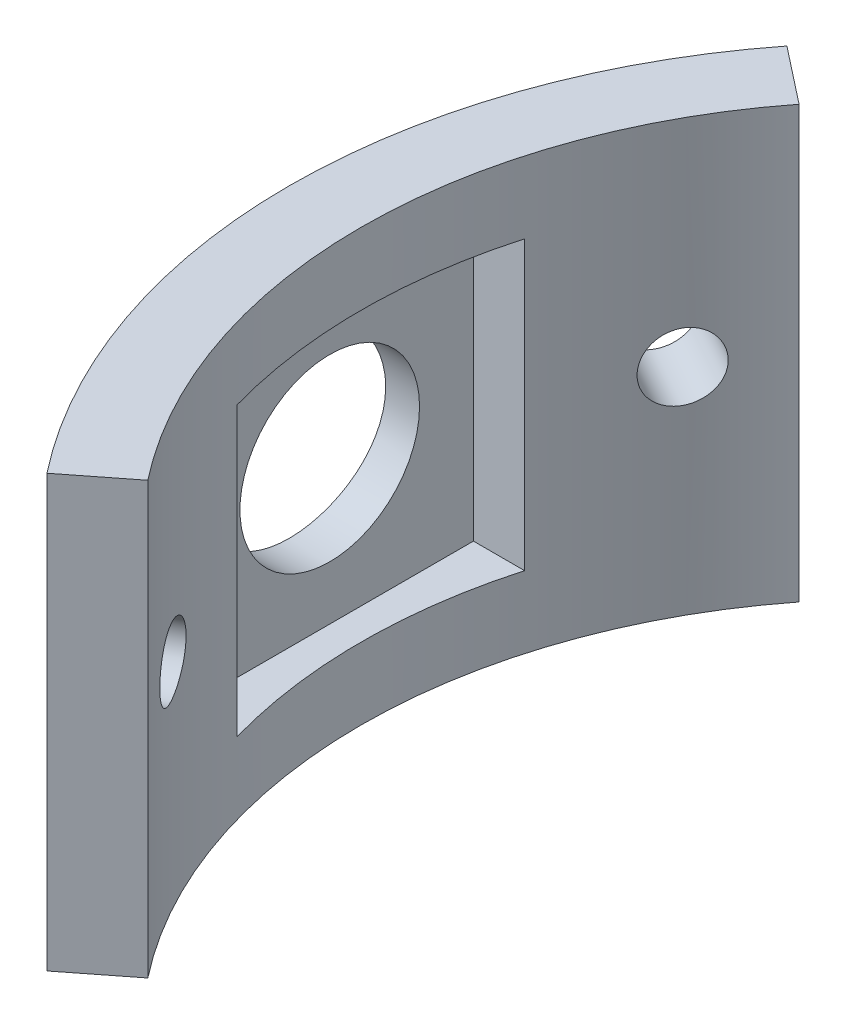
ISO-10303-21;
HEADER;
FILE_DESCRIPTION(('STEP AP214'),'2;1');
FILE_NAME('part.step','',(''),(''),'','','');
FILE_SCHEMA(('AUTOMOTIVE_DESIGN { 1 0 10303 214 1 1 1 1 }'));
ENDSEC;
DATA;
#1=APPLICATION_CONTEXT('core data for automotive mechanical design processes');
#2=APPLICATION_PROTOCOL_DEFINITION('international standard','automotive_design',2000,#1);
#3=PRODUCT_CONTEXT('',#1,'mechanical');
#4=PRODUCT('Part','Part','',(#3));
#5=PRODUCT_RELATED_PRODUCT_CATEGORY('part','',(#4));
#6=PRODUCT_DEFINITION_FORMATION('','',#4);
#7=PRODUCT_DEFINITION_CONTEXT('part definition',#1,'design');
#8=PRODUCT_DEFINITION('design','',#6,#7);
#9=PRODUCT_DEFINITION_SHAPE('','',#8);
#10=(LENGTH_UNIT() NAMED_UNIT(*) SI_UNIT(.MILLI.,.METRE.));
#11=(NAMED_UNIT(*) PLANE_ANGLE_UNIT() SI_UNIT($,.RADIAN.));
#12=(NAMED_UNIT(*) SI_UNIT($,.STERADIAN.) SOLID_ANGLE_UNIT());
#13=UNCERTAINTY_MEASURE_WITH_UNIT(LENGTH_MEASURE(1.E-05),#10,'distance_accuracy_value','');
#14=(GEOMETRIC_REPRESENTATION_CONTEXT(3) GLOBAL_UNCERTAINTY_ASSIGNED_CONTEXT((#13)) GLOBAL_UNIT_ASSIGNED_CONTEXT((#10,
#11,#12)) REPRESENTATION_CONTEXT('',''));
#15=CARTESIAN_POINT('',(0.,0.,0.));
#16=DIRECTION('',(0.,0.,1.));
#17=DIRECTION('',(1.,0.,0.));
#18=AXIS2_PLACEMENT_3D('',#15,#16,#17);
#19=CARTESIAN_POINT('',(-0.303238359251435,11.,1.55239062475204));
#20=DIRECTION('',(-0.617186043259902,0.,0.786817251974807));
#21=DIRECTION('',(0.,1.,0.));
#22=AXIS2_PLACEMENT_3D('',#19,#20,#21);
#23=PLANE('',#22);
#24=DIRECTION('',(-0.786817251974807,0.,-0.617186043259902));
#25=VECTOR('',#24,1.);
#26=CARTESIAN_POINT('',(-0.303238359251435,20.,1.55239062475205));
#27=LINE('',#26,#25);
#28=CARTESIAN_POINT('',(-0.303238359251435,20.,1.55239062475205));
#29=VERTEX_POINT('',#28);
#30=CARTESIAN_POINT('',(-2.66369011517584,20.,-0.299167505027672));
#31=VERTEX_POINT('',#30);
#32=EDGE_CURVE('E144',#29,#31,#27,.T.);
#33=ORIENTED_EDGE('',*,*,#32,.F.);
#34=DIRECTION('',(0.,1.,0.));
#35=VECTOR('',#34,1.);
#36=CARTESIAN_POINT('',(-0.303238359251435,0.,1.55239062475204));
#37=LINE('',#36,#35);
#38=CARTESIAN_POINT('',(-0.303238359251435,2.,1.55239062475205));
#39=VERTEX_POINT('',#38);
#40=EDGE_CURVE('E136',#29,#39,#37,.F.);
#41=ORIENTED_EDGE('',*,*,#40,.T.);
#42=DIRECTION('',(-0.786817251974807,0.,-0.617186043259902));
#43=VECTOR('',#42,1.);
#44=CARTESIAN_POINT('',(-0.303238359251435,2.,1.55239062475205));
#45=LINE('',#44,#43);
#46=CARTESIAN_POINT('',(-2.66369011517584,2.,-0.299167505027672));
#47=VERTEX_POINT('',#46);
#48=EDGE_CURVE('E121',#39,#47,#45,.T.);
#49=ORIENTED_EDGE('',*,*,#48,.T.);
#50=DIRECTION('',(0.,1.,0.));
#51=VECTOR('',#50,1.);
#52=CARTESIAN_POINT('',(-2.66369011517584,0.,-0.299167505027672));
#53=LINE('',#52,#51);
#54=EDGE_CURVE('E215',#31,#47,#53,.F.);
#55=ORIENTED_EDGE('',*,*,#54,.F.);
#56=EDGE_LOOP('',(#33,#41,#49,#55));
#57=FACE_BOUND('',#56,.T.);
#58=ADVANCED_FACE('F61',(#57),#23,.F.);
#59=CARTESIAN_POINT('',(17.0316216216216,2.,15.15));
#60=DIRECTION('',(0.,-1.,0.));
#61=DIRECTION('',(0.,0.,-1.));
#62=AXIS2_PLACEMENT_3D('',#59,#60,#61);
#63=PLANE('',#62);
#64=ORIENTED_EDGE('',*,*,#48,.F.);
#65=CARTESIAN_POINT('',(17.0316216216216,2.,15.15));
#66=DIRECTION('',(0.,1.,0.));
#67=DIRECTION('',(0.,0.,1.));
#68=AXIS2_PLACEMENT_3D('',#65,#66,#67);
#69=CIRCLE('',#68,22.0316216216216);
#70=CARTESIAN_POINT('',(-0.303238359251494,2.,28.7476093752479));
#71=VERTEX_POINT('',#70);
#72=EDGE_CURVE('E129',#39,#71,#69,.T.);
#73=ORIENTED_EDGE('',*,*,#72,.T.);
#74=DIRECTION('',(-0.786817251974809,0.,0.617186043259898));
#75=VECTOR('',#74,1.);
#76=CARTESIAN_POINT('',(-0.303238359251494,2.,28.7476093752479));
#77=LINE('',#76,#75);
#78=CARTESIAN_POINT('',(-2.66369011517593,2.,30.5991675050276));
#79=VERTEX_POINT('',#78);
#80=EDGE_CURVE('E90',#71,#79,#77,.T.);
#81=ORIENTED_EDGE('',*,*,#80,.T.);
#82=CARTESIAN_POINT('',(17.0316216216216,2.,15.15));
#83=DIRECTION('',(0.,1.,0.));
#84=DIRECTION('',(0.,0.,1.));
#85=AXIS2_PLACEMENT_3D('',#82,#83,#84);
#86=CIRCLE('',#85,25.0316216216216);
#87=EDGE_CURVE('E148',#47,#79,#86,.T.);
#88=ORIENTED_EDGE('',*,*,#87,.F.);
#89=EDGE_LOOP('',(#64,#73,#81,#88));
#90=FACE_BOUND('',#89,.T.);
#91=ADVANCED_FACE('F134',(#90),#63,.T.);
#92=CARTESIAN_POINT('',(-0.303238359251494,11.,28.7476093752479));
#93=DIRECTION('',(0.617186043259898,0.,0.786817251974809));
#94=DIRECTION('',(0.,1.,0.));
#95=AXIS2_PLACEMENT_3D('',#92,#93,#94);
#96=PLANE('',#95);
#97=ORIENTED_EDGE('',*,*,#80,.F.);
#98=DIRECTION('',(0.,1.,0.));
#99=VECTOR('',#98,1.);
#100=CARTESIAN_POINT('',(-0.303238359251494,0.,28.7476093752479));
#101=LINE('',#100,#99);
#102=CARTESIAN_POINT('',(-0.303238359251494,20.,28.7476093752479));
#103=VERTEX_POINT('',#102);
#104=EDGE_CURVE('E117',#103,#71,#101,.F.);
#105=ORIENTED_EDGE('',*,*,#104,.F.);
#106=DIRECTION('',(-0.786817251974809,0.,0.617186043259898));
#107=VECTOR('',#106,1.);
#108=CARTESIAN_POINT('',(-0.303238359251494,20.,28.7476093752479));
#109=LINE('',#108,#107);
#110=CARTESIAN_POINT('',(-2.66369011517593,20.,30.5991675050276));
#111=VERTEX_POINT('',#110);
#112=EDGE_CURVE('E122',#103,#111,#109,.T.);
#113=ORIENTED_EDGE('',*,*,#112,.T.);
#114=DIRECTION('',(0.,1.,0.));
#115=VECTOR('',#114,1.);
#116=CARTESIAN_POINT('',(-2.66369011517593,0.,30.5991675050276));
#117=LINE('',#116,#115);
#118=EDGE_CURVE('E119',#111,#79,#117,.F.);
#119=ORIENTED_EDGE('',*,*,#118,.T.);
#120=EDGE_LOOP('',(#97,#105,#113,#119));
#121=FACE_BOUND('',#120,.T.);
#122=ADVANCED_FACE('F116',(#121),#96,.T.);
#123=CARTESIAN_POINT('',(17.0316216216216,20.,15.15));
#124=DIRECTION('',(0.,-1.,0.));
#125=DIRECTION('',(0.,0.,-1.));
#126=AXIS2_PLACEMENT_3D('',#123,#124,#125);
#127=PLANE('',#126);
#128=CARTESIAN_POINT('',(17.0316216216216,20.,15.15));
#129=DIRECTION('',(0.,1.,0.));
#130=DIRECTION('',(0.,0.,1.));
#131=AXIS2_PLACEMENT_3D('',#128,#129,#130);
#132=CIRCLE('',#131,22.0316216216216);
#133=EDGE_CURVE('E131',#103,#29,#132,.F.);
#134=ORIENTED_EDGE('',*,*,#133,.T.);
#135=ORIENTED_EDGE('',*,*,#32,.T.);
#136=CARTESIAN_POINT('',(17.0316216216216,20.,15.15));
#137=DIRECTION('',(0.,1.,0.));
#138=DIRECTION('',(0.,0.,1.));
#139=AXIS2_PLACEMENT_3D('',#136,#137,#138);
#140=CIRCLE('',#139,25.0316216216216);
#141=EDGE_CURVE('E138',#111,#31,#140,.F.);
#142=ORIENTED_EDGE('',*,*,#141,.F.);
#143=ORIENTED_EDGE('',*,*,#112,.F.);
#144=EDGE_LOOP('',(#134,#135,#142,#143));
#145=FACE_BOUND('',#144,.T.);
#146=ADVANCED_FACE('F63',(#145),#127,.F.);
#147=CARTESIAN_POINT('',(17.0316216216216,0.,15.15));
#148=DIRECTION('',(0.,1.,0.));
#149=DIRECTION('',(0.,0.,1.));
#150=AXIS2_PLACEMENT_3D('',#147,#148,#149);
#151=CYLINDRICAL_SURFACE('',#150,25.0316216216216);
#152=CARTESIAN_POINT('',(-4.16122475319626,11.,28.4708612162053));
#153=CARTESIAN_POINT('',(-4.16122688903331,11.0785726039245,28.470858439912));
#154=CARTESIAN_POINT('',(-4.16476456231564,11.1572006146944,28.465234689333));
#155=CARTESIAN_POINT('',(-4.17879963327515,11.3122866501497,28.4428657111306));
#156=CARTESIAN_POINT('',(-4.18930518680777,11.3887420222823,28.4261074506002));
#157=CARTESIAN_POINT('',(-4.21689345756117,11.5372138189106,28.3819069939177));
#158=CARTESIAN_POINT('',(-4.23397276877172,11.6092325197651,28.3544703304016));
#159=CARTESIAN_POINT('',(-4.27409549281385,11.7468108301633,28.2896326301292));
#160=CARTESIAN_POINT('',(-4.29713751664843,11.8123719390805,28.2522339139453));
#161=CARTESIAN_POINT('',(-4.3484107852665,11.9352739767596,28.1683987118473));
#162=CARTESIAN_POINT('',(-4.37664761903269,11.9926059325452,28.1219524887211));
#163=CARTESIAN_POINT('',(-4.43733192276439,12.097345570518,28.0212688716168));
#164=CARTESIAN_POINT('',(-4.46977956618202,12.1447528436763,27.9670311566808));
#165=CARTESIAN_POINT('',(-4.53783108907861,12.2283234912181,27.8521747180915));
#166=CARTESIAN_POINT('',(-4.57343697007035,12.2644796689165,27.7915519433207));
#167=CARTESIAN_POINT('',(-4.6466431745861,12.3244756518991,27.66559893932));
#168=CARTESIAN_POINT('',(-4.68424348022151,12.348315567631,27.6002687523104));
#169=CARTESIAN_POINT('',(-4.76023448748166,12.3829780264683,27.466776268765));
#170=CARTESIAN_POINT('',(-4.79862431205511,12.3938142962469,27.3986170373723));
#171=CARTESIAN_POINT('',(-4.87509608850756,12.4022042363721,27.2613159521207));
#172=CARTESIAN_POINT('',(-4.91317804327408,12.3997580314406,27.1921741074946));
#173=CARTESIAN_POINT('',(-4.98791880409967,12.3816638195915,27.0549577548413));
#174=CARTESIAN_POINT('',(-5.02457915440599,12.3660305829126,26.9868821394309));
#175=CARTESIAN_POINT('',(-5.09554626164356,12.3220289851398,26.8536840803935));
#176=CARTESIAN_POINT('',(-5.12985300688987,12.2936605608249,26.7885616514287));
#177=CARTESIAN_POINT('',(-5.19527113217661,12.22497707365,26.6631373180515));
#178=CARTESIAN_POINT('',(-5.22638070327375,12.1846552972195,26.6028381468419));
#179=CARTESIAN_POINT('',(-5.28464852556937,12.0932145866298,26.4888831049523));
#180=CARTESIAN_POINT('',(-5.31180674146039,12.0420955560015,26.4352272936349));
#181=CARTESIAN_POINT('',(-5.36160179777057,11.9304279550421,26.3360946824276));
#182=CARTESIAN_POINT('',(-5.38423239572807,11.8698665678386,26.2906291834246));
#183=CARTESIAN_POINT('',(-5.42444674772239,11.7410783399918,26.2093461625257));
#184=CARTESIAN_POINT('',(-5.44203050014561,11.6728514968976,26.1735286437146));
#185=CARTESIAN_POINT('',(-5.47179554798281,11.5306610887107,26.1126388711525));
#186=CARTESIAN_POINT('',(-5.48397661344675,11.4566972795977,26.0875670747643));
#187=CARTESIAN_POINT('',(-5.50269582812571,11.3051361271492,26.0489486920024));
#188=CARTESIAN_POINT('',(-5.50923403045558,11.2275388180222,26.0354019971459));
#189=CARTESIAN_POINT('',(-5.51653679743824,11.0710258990322,26.0202670139627));
#190=CARTESIAN_POINT('',(-5.517309170309,10.9921122171256,26.0186625531985));
#191=CARTESIAN_POINT('',(-5.51308617171303,10.8351077030591,26.0274194659527));
#192=CARTESIAN_POINT('',(-5.50809082419971,10.7570168674833,26.0377807897771));
#193=CARTESIAN_POINT('',(-5.49243312783408,10.6039252767971,26.0701354382018));
#194=CARTESIAN_POINT('',(-5.48177438841175,10.5289225862979,26.0921213540973));
#195=CARTESIAN_POINT('',(-5.45499927960622,10.3840766636832,26.1470400251857));
#196=CARTESIAN_POINT('',(-5.43888287061742,10.3142334690139,26.1799728598188));
#197=CARTESIAN_POINT('',(-5.40149436190278,10.1816066920417,26.2558169880322));
#198=CARTESIAN_POINT('',(-5.38021673633666,10.1188307824874,26.2987389744554));
#199=CARTESIAN_POINT('',(-5.33295834124467,10.0021977838716,26.3932391962076));
#200=CARTESIAN_POINT('',(-5.30697753452303,9.94834076535294,26.4448174999959));
#201=CARTESIAN_POINT('',(-5.25085117542532,9.85101395557277,26.5551442129389));
#202=CARTESIAN_POINT('',(-5.22070103392567,9.80755575605699,26.6139005143835));
#203=CARTESIAN_POINT('',(-5.15696022739259,9.73233948028686,26.736789949261));
#204=CARTESIAN_POINT('',(-5.12336958013654,9.70058134358125,26.8009230549112));
#205=CARTESIAN_POINT('',(-5.05359990842647,9.64968691298777,26.9326405128425));
#206=CARTESIAN_POINT('',(-5.01742241117828,9.63054323896046,27.0002228221705));
#207=CARTESIAN_POINT('',(-4.94341266874826,9.6053969911867,27.1369089647675));
#208=CARTESIAN_POINT('',(-4.90558043600499,9.59939431867737,27.2060127865976));
#209=CARTESIAN_POINT('',(-4.8293658079514,9.60070140510823,27.3436660089288));
#210=CARTESIAN_POINT('',(-4.79098423425417,9.6079930006869,27.4122160375438));
#211=CARTESIAN_POINT('',(-4.71474040641882,9.63564404333573,27.5469275315806));
#212=CARTESIAN_POINT('',(-4.67687815323237,9.65600351434988,27.6130889926258));
#213=CARTESIAN_POINT('',(-4.60282795819311,9.70920847011614,27.7411933812675));
#214=CARTESIAN_POINT('',(-4.56664001903359,9.74205397495238,27.8031363020781));
#215=CARTESIAN_POINT('',(-4.49708640330516,9.81929582559123,27.9211200587081));
#216=CARTESIAN_POINT('',(-4.46372064615038,9.86369184142765,27.9771610630647));
#217=CARTESIAN_POINT('',(-4.40086413929943,9.96284067045422,28.0819131593321));
#218=CARTESIAN_POINT('',(-4.37137830172386,10.0176064022721,28.1306149706656));
#219=CARTESIAN_POINT('',(-4.31732238035604,10.1359266829485,28.2193296481375));
#220=CARTESIAN_POINT('',(-4.29275350489677,10.1994833856957,28.259340378667));
#221=CARTESIAN_POINT('',(-4.24937177888183,10.3336415280431,28.3296477479848));
#222=CARTESIAN_POINT('',(-4.2305652002704,10.4042505336683,28.3599338037048));
#223=CARTESIAN_POINT('',(-4.1994311862824,10.5504021463711,28.4099152670459));
#224=CARTESIAN_POINT('',(-4.18709612691051,10.6259388296845,28.4296231372962));
#225=CARTESIAN_POINT('',(-4.17257319508968,10.7516180427672,28.4527932344349));
#226=CARTESIAN_POINT('',(-4.16832422093801,10.8009472447026,28.4595607063858));
#227=CARTESIAN_POINT('',(-4.16264932300659,10.9001768423252,28.4685955768047));
#228=CARTESIAN_POINT('',(-4.1612233961471,10.9500772373893,28.4708629801819));
#229=CARTESIAN_POINT('',(-4.16122475319626,11.,28.4708612162053));
#230=B_SPLINE_CURVE_WITH_KNOTS('',3,(#152,#153,#154,#155,#156,#157,#158,#159,#160,#161,#162,
#163,#164,#165,#166,#167,#168,#169,#170,#171,#172,#173,#174,#175,#176,#177,#178,#179,#180,#181,
#182,#183,#184,#185,#186,#187,#188,#189,#190,#191,#192,#193,#194,#195,#196,#197,#198,#199,#200,
#201,#202,#203,#204,#205,#206,#207,#208,#209,#210,#211,#212,#213,#214,#215,#216,#217,#218,#219,
#220,#221,#222,#223,#224,#225,#226,#227,#228,#229),.UNSPECIFIED.,.T.,.F.,(4,2,2,2,2,2,2,2,2,2,2,
2,2,2,2,2,2,2,2,2,2,2,2,2,2,2,2,2,2,2,2,2,2,2,2,2,2,2,4),(0.,0.235535569200545,
0.471347318832648,0.707037053259687,0.942671933777331,1.17856182723988,1.4144614405908,
1.65051163679497,1.88655971614992,2.12235840290077,2.35815487551655,2.59368759258741,
2.829221478923,3.06488790372307,3.30055643419765,3.53654768718188,3.77253901561853,
4.00854038739322,4.24453953772309,4.48021903453609,4.71589755257253,4.95142604628288,
5.18695624923025,5.42273974360553,5.65852510278982,5.89457208422393,6.13061784604572,
6.36652538548976,6.60243115193422,6.83801485241499,7.07359898455198,7.30918349563404,
7.54476127745587,7.78063449720688,8.01656561131257,8.25275261865433,8.48866074941595,
8.63831340884306,8.78796590500942),.UNSPECIFIED.);
#231=CARTESIAN_POINT('',(-4.16122475319626,11.,28.4708612162053));
#232=VERTEX_POINT('',#231);
#233=EDGE_CURVE('E12',#232,#232,#230,.T.);
#234=ORIENTED_EDGE('',*,*,#233,.F.);
#235=EDGE_LOOP('',(#234));
#236=FACE_BOUND('',#235,.T.);
#237=CARTESIAN_POINT('',(-5.51635825428335,11.,4.27936595575863));
#238=CARTESIAN_POINT('',(-5.51635703793024,11.0785726039245,4.27936267093145));
#239=CARTESIAN_POINT('',(-5.51347390682765,11.1572006146944,4.27337691635308));
#240=CARTESIAN_POINT('',(-5.50198667238878,11.3122866501497,4.24959882039046));
#241=CARTESIAN_POINT('',(-5.49337586481282,11.3887420222823,4.23179264326229));
#242=CARTESIAN_POINT('',(-5.47060054717422,11.5372138189106,4.18493031339523));
#243=CARTESIAN_POINT('',(-5.45643891304877,11.6092325197651,4.15587998645703));
#244=CARTESIAN_POINT('',(-5.42284557493181,11.7468108301633,4.08743111506141));
#245=CARTESIAN_POINT('',(-5.40341509825184,11.8123719390805,4.04803498059889));
#246=CARTESIAN_POINT('',(-5.35965706705011,11.9352739767596,3.96004336798184));
#247=CARTESIAN_POINT('',(-5.33532423548394,11.9926059325452,3.91143798009326));
#248=CARTESIAN_POINT('',(-5.28229725880271,12.097345570518,3.80651936774705));
#249=CARTESIAN_POINT('',(-5.2536029340202,12.1447528436763,3.75020582576906));
#250=CARTESIAN_POINT('',(-5.19248698086935,12.2283234912181,3.63151357023223));
#251=CARTESIAN_POINT('',(-5.16006298492678,12.2644796689165,3.56913100801146));
#252=CARTESIAN_POINT('',(-5.09228771904916,12.3244756518991,3.44017434501324));
#253=CARTESIAN_POINT('',(-5.05693647536791,12.348315567631,3.37360028182966));
#254=CARTESIAN_POINT('',(-4.98425520885556,12.3829780264683,3.23827729839492));
#255=CARTESIAN_POINT('',(-4.94692731613134,12.3938142962469,3.16953075026632));
#256=CARTESIAN_POINT('',(-4.87127556832759,12.4022042363721,3.03177613633522));
#257=CARTESIAN_POINT('',(-4.83295172260339,12.3997580314406,2.96276807299443));
#258=CARTESIAN_POINT('',(-4.75645165282075,12.3816638195915,2.82652473155158));
#259=CARTESIAN_POINT('',(-4.71827531158771,12.3660305829126,2.75928755680325));
#260=CARTESIAN_POINT('',(-4.64317305995403,12.3220289851398,2.6283764990558));
#261=CARTESIAN_POINT('',(-4.60624715576189,12.2936605608249,2.56470263374774));
#262=CARTESIAN_POINT('',(-4.53478006471341,12.22497707365,2.44262376818863));
#263=CARTESIAN_POINT('',(-4.50024023146595,12.1846552972195,2.38422175296951));
#264=CARTESIAN_POINT('',(-4.43468742534401,12.0932145866298,2.27429577652774));
#265=CARTESIAN_POINT('',(-4.40367448398472,12.0420955560015,2.22277187676502));
#266=CARTESIAN_POINT('',(-4.34617326163969,11.9304279550421,2.12790127190487));
#267=CARTESIAN_POINT('',(-4.31969123484245,11.8698665678386,2.08456586120859));
#268=CARTESIAN_POINT('',(-4.27221680552618,11.7410783399918,2.00729813085583));
#269=CARTESIAN_POINT('',(-4.25122440476233,11.6728514968976,1.97336581420577));
#270=CARTESIAN_POINT('',(-4.21546965053725,11.5306610887107,1.91578873520973));
#271=CARTESIAN_POINT('',(-4.2007075622529,11.4566972795977,1.89214441074377));
#272=CARTESIAN_POINT('',(-4.17794626294208,11.3051361271492,1.85576156122613));
#273=CARTESIAN_POINT('',(-4.16994698825899,11.2275388180222,1.84302293352191));
#274=CARTESIAN_POINT('',(-4.16100876673418,11.0710258990322,1.82879246207745));
#275=CARTESIAN_POINT('',(-4.1600602715731,10.9921122171256,1.82728540828785));
#276=CARTESIAN_POINT('',(-4.16523303318371,10.8351077030591,1.83551704089908));
#277=CARTESIAN_POINT('',(-4.17135426059475,10.7570168674833,1.84525568059638));
#278=CARTESIAN_POINT('',(-4.19043724635416,10.6039252767971,1.87571592328538));
#279=CARTESIAN_POINT('',(-4.2033946477903,10.5289225862979,1.89643053097806));
#280=CARTESIAN_POINT('',(-4.23568091249783,10.3840766636832,1.94830117775337));
#281=CARTESIAN_POINT('',(-4.25500982200644,10.3142334690139,1.97945729260867));
#282=CARTESIAN_POINT('',(-4.29937933985726,10.1816066920417,2.05144047296382));
#283=CARTESIAN_POINT('',(-4.32442606826091,10.1188307824874,2.09227790266407));
#284=CARTESIAN_POINT('',(-4.37935180710218,10.0021977838716,2.18253758929442));
#285=CARTESIAN_POINT('',(-4.40923085575669,9.94834076535295,2.23195991411928));
#286=CARTESIAN_POINT('',(-4.47284859357079,9.85101395557277,2.33814341194165));
#287=CARTESIAN_POINT('',(-4.50659152851661,9.80755575605699,2.39491266711676));
#288=CARTESIAN_POINT('',(-4.57680301872808,9.73233948028686,2.51422339699585));
#289=CARTESIAN_POINT('',(-4.61327155991004,9.70058134358125,2.5767648418743));
#290=CARTESIAN_POINT('',(-4.6877561653371,9.64968691298777,2.7058746376637));
#291=CARTESIAN_POINT('',(-4.7257713108872,9.63054323896046,2.77244060907588));
#292=CARTESIAN_POINT('',(-4.80221083426576,9.6053969911867,2.90778292625084));
#293=CARTESIAN_POINT('',(-4.84063520901642,9.59939431867737,2.97655925539744));
#294=CARTESIAN_POINT('',(-4.91672191305682,9.60070140510823,3.11428322795045));
#295=CARTESIAN_POINT('',(-4.95438521109743,9.6079930006869,3.18323050928401));
#296=CARTESIAN_POINT('',(-5.02796464183795,9.63564404333573,3.31941558658887));
#297=CARTESIAN_POINT('',(-5.06388077133645,9.65600351434988,3.38665337942768));
#298=CARTESIAN_POINT('',(-5.13302972990311,9.70920847011614,3.51746846763905));
#299=CARTESIAN_POINT('',(-5.16626255465501,9.74205397495238,3.5810457571234));
#300=CARTESIAN_POINT('',(-5.22922904842776,9.81929582559123,3.70267261662158));
#301=CARTESIAN_POINT('',(-5.25896281737173,9.86369184142765,3.76072234447789));
#302=CARTESIAN_POINT('',(-5.31428134655429,9.96284067045422,3.86964342808893));
#303=CARTESIAN_POINT('',(-5.33986085675977,10.0176064022721,3.92050569015373));
#304=CARTESIAN_POINT('',(-5.38627290951599,10.1359266829485,4.01344791948362));
#305=CARTESIAN_POINT('',(-5.40710428539715,10.1994833856957,4.05552572809738));
#306=CARTESIAN_POINT('',(-5.443598365131,10.3336415280431,4.129642409599));
#307=CARTESIAN_POINT('',(-5.45925543848494,10.4042505336683,4.16167034465777));
#308=CARTESIAN_POINT('',(-5.48504279948562,10.5504021463711,4.21460885160069));
#309=CARTESIAN_POINT('',(-5.4951795910274,10.6259388296845,4.23553250560158));
#310=CARTESIAN_POINT('',(-5.50708608819895,10.7516180427672,4.26014965968551));
#311=CARTESIAN_POINT('',(-5.51055991300726,10.8009472447026,4.26734583916834));
#312=CARTESIAN_POINT('',(-5.5151963812066,10.9001768423252,4.276955028138));
#313=CARTESIAN_POINT('',(-5.51635902711897,10.9500772373893,4.27936804284292));
#314=CARTESIAN_POINT('',(-5.51635825428335,11.,4.27936595575863));
#315=B_SPLINE_CURVE_WITH_KNOTS('',3,(#237,#238,#239,#240,#241,#242,#243,#244,#245,#246,#247,
#248,#249,#250,#251,#252,#253,#254,#255,#256,#257,#258,#259,#260,#261,#262,#263,#264,#265,#266,
#267,#268,#269,#270,#271,#272,#273,#274,#275,#276,#277,#278,#279,#280,#281,#282,#283,#284,#285,
#286,#287,#288,#289,#290,#291,#292,#293,#294,#295,#296,#297,#298,#299,#300,#301,#302,#303,#304,
#305,#306,#307,#308,#309,#310,#311,#312,#313,#314),.UNSPECIFIED.,.T.,.F.,(4,2,2,2,2,2,2,2,2,2,2,
2,2,2,2,2,2,2,2,2,2,2,2,2,2,2,2,2,2,2,2,2,2,2,2,2,2,2,4),(0.,0.235535569200545,
0.471347318832648,0.707037053259687,0.942671933777331,1.17856182723988,1.4144614405908,
1.65051163679497,1.88655971614992,2.12235840290077,2.35815487551655,2.59368759258741,
2.82922147892301,3.06488790372307,3.30055643419764,3.53654768718188,3.77253901561853,
4.00854038739322,4.2445395377231,4.48021903453609,4.71589755257253,4.95142604628287,
5.18695624923024,5.42273974360553,5.65852510278982,5.89457208422393,6.13061784604572,
6.36652538548976,6.60243115193422,6.83801485241499,7.07359898455198,7.30918349563404,
7.54476127745587,7.78063449720688,8.01656561131257,8.25275261865433,8.48866074941595,
8.63831340884306,8.78796590500942),.UNSPECIFIED.);
#316=CARTESIAN_POINT('',(-5.51635825428335,11.,4.27936595575863));
#317=VERTEX_POINT('',#316);
#318=EDGE_CURVE('E74',#317,#317,#315,.T.);
#319=ORIENTED_EDGE('',*,*,#318,.F.);
#320=EDGE_LOOP('',(#319));
#321=FACE_BOUND('',#320,.T.);
#322=CARTESIAN_POINT('',(-8.00000000000003,14.75,15.1499999999999));
#323=CARTESIAN_POINT('',(-7.99999664716297,14.7499913629436,14.9406179838802));
#324=CARTESIAN_POINT('',(-7.99734533932594,14.7324044681495,14.731114398116));
#325=CARTESIAN_POINT('',(-7.98702391558981,14.6625392528528,14.3179629470587));
#326=CARTESIAN_POINT('',(-7.97934891017014,14.6102271338934,14.1143209886322));
#327=CARTESIAN_POINT('',(-7.959842605817,14.4725094740821,13.7189317225487));
#328=CARTESIAN_POINT('',(-7.94801444607384,14.3871289232234,13.5271755593697));
#329=CARTESIAN_POINT('',(-7.92150891066058,14.1857590498038,13.1607414277462));
#330=CARTESIAN_POINT('',(-7.9068319315406,14.069773986525,12.986061087463));
#331=CARTESIAN_POINT('',(-7.87613303388742,13.8095243479569,12.6573464701584));
#332=CARTESIAN_POINT('',(-7.8601024560619,13.6650683438916,12.503464543576));
#333=CARTESIAN_POINT('',(-7.82857090142636,13.3523893163387,12.2220293233083));
#334=CARTESIAN_POINT('',(-7.8130699550916,13.1841649280569,12.0944775425508));
#335=CARTESIAN_POINT('',(-7.78426868086469,12.8277010697366,11.868730505815));
#336=CARTESIAN_POINT('',(-7.77097954305253,12.6393672926793,11.7706826129957));
#337=CARTESIAN_POINT('',(-7.74822469384723,12.2486725327221,11.607668308383));
#338=CARTESIAN_POINT('',(-7.73875877460481,12.0463123130706,11.5427000981626));
#339=CARTESIAN_POINT('',(-7.72480721799083,11.6349109868401,11.4481624202573));
#340=CARTESIAN_POINT('',(-7.7202849078176,11.4259310749655,11.418332161325));
#341=CARTESIAN_POINT('',(-7.71662124932269,11.005886616133,11.3941092591236));
#342=CARTESIAN_POINT('',(-7.71747959281159,10.794822189262,11.3997145861991));
#343=CARTESIAN_POINT('',(-7.72444672576048,10.3784421147252,11.4459906092919));
#344=CARTESIAN_POINT('',(-7.73051202650869,10.1730933561821,11.4863708724488));
#345=CARTESIAN_POINT('',(-7.74714173063094,9.77211918506412,11.6005958890608));
#346=CARTESIAN_POINT('',(-7.75770626098544,9.57649404709016,11.6744415870052));
#347=CARTESIAN_POINT('',(-7.78219211124758,9.19963638681831,11.8538034184433));
#348=CARTESIAN_POINT('',(-7.79612643084946,9.01846330625527,11.9594425977613));
#349=CARTESIAN_POINT('',(-7.82577240673849,8.67630504654947,12.1993050491126));
#350=CARTESIAN_POINT('',(-7.84148417935442,8.51532119018426,12.3335301925164));
#351=CARTESIAN_POINT('',(-7.8731068906737,8.21642786461373,12.6283487662485));
#352=CARTESIAN_POINT('',(-7.88901825253078,8.07876462566627,12.7891919055357));
#353=CARTESIAN_POINT('',(-7.91910174198614,7.83234818995981,13.1318295770501));
#354=CARTESIAN_POINT('',(-7.93327386200287,7.72359511922079,13.3136242006002));
#355=CARTESIAN_POINT('',(-7.95829680757428,7.53807355305478,13.693217599645));
#356=CARTESIAN_POINT('',(-7.96914566233745,7.46132402693904,13.8910257840801));
#357=CARTESIAN_POINT('',(-7.98628320933406,7.34220210757669,14.2969221558737));
#358=CARTESIAN_POINT('',(-7.99257220906686,7.29982739619983,14.5050096490234));
#359=CARTESIAN_POINT('',(-7.99984072432137,7.25098532233288,14.923432619811));
#360=CARTESIAN_POINT('',(-8.00087029385404,7.24417943682687,15.1337277445657));
#361=CARTESIAN_POINT('',(-7.99764018661451,7.26576970477271,15.5524563290521));
#362=CARTESIAN_POINT('',(-7.99338067315857,7.29416477128979,15.7608898460664));
#363=CARTESIAN_POINT('',(-7.98008196823161,7.38506941935217,16.1689533781283));
#364=CARTESIAN_POINT('',(-7.9710658864871,7.44741410385027,16.3686209451897));
#365=CARTESIAN_POINT('',(-7.94926174095363,7.60427437886278,16.7546691672925));
#366=CARTESIAN_POINT('',(-7.93647350041556,7.69879147688674,16.941049199222));
#367=CARTESIAN_POINT('',(-7.90842183603541,7.91810798585914,17.2967204512158));
#368=CARTESIAN_POINT('',(-7.89314112400466,8.04312216860538,17.4658778486086));
#369=CARTESIAN_POINT('',(-7.86185921350301,8.31958509329506,17.7809322938494));
#370=CARTESIAN_POINT('',(-7.8458579733103,8.4710353674708,17.9268279925141));
#371=CARTESIAN_POINT('',(-7.81477976748235,8.7975782613355,18.1924491060808));
#372=CARTESIAN_POINT('',(-7.79971156067691,8.97285641312103,18.3119476167341));
#373=CARTESIAN_POINT('',(-7.7723605500575,9.3411964613288,18.5198051180117));
#374=CARTESIAN_POINT('',(-7.76007767113905,9.53425787803991,18.6081649483051));
#375=CARTESIAN_POINT('',(-7.73975139222665,9.93200708983884,18.750885084764));
#376=CARTESIAN_POINT('',(-7.73169311040084,10.1366512205542,18.8053648669971));
#377=CARTESIAN_POINT('',(-7.72068881356267,10.5523142389101,18.8791587083222));
#378=CARTESIAN_POINT('',(-7.71774244647641,10.7633326865125,18.8984751892275));
#379=CARTESIAN_POINT('',(-7.71730869772712,11.1834926956037,18.9013365993581));
#380=CARTESIAN_POINT('',(-7.71976687023635,11.3926318585828,18.885238299363));
#381=CARTESIAN_POINT('',(-7.72974690818838,11.8051927411658,18.8184915868666));
#382=CARTESIAN_POINT('',(-7.73726876559658,12.0086144698411,18.7678432291864));
#383=CARTESIAN_POINT('',(-7.75650963279181,12.4038676376509,18.6335601602346));
#384=CARTESIAN_POINT('',(-7.76822547712485,12.5957076908975,18.5499503221662));
#385=CARTESIAN_POINT('',(-7.7945381052704,12.9626949520247,18.3521531783247));
#386=CARTESIAN_POINT('',(-7.8091349861317,13.1378415972868,18.2379648424573));
#387=CARTESIAN_POINT('',(-7.8397400540895,13.4682829741416,17.9809557039488));
#388=CARTESIAN_POINT('',(-7.85576044009858,13.6233710757152,17.8378706555807));
#389=CARTESIAN_POINT('',(-7.88730553797148,13.9074619755145,17.5276881250188));
#390=CARTESIAN_POINT('',(-7.90283013374387,14.0364587015011,17.3605850685633));
#391=CARTESIAN_POINT('',(-7.93173176412988,14.2653374458578,17.0060310660852));
#392=CARTESIAN_POINT('',(-7.9450965423115,14.3650557574725,16.8184734593634));
#393=CARTESIAN_POINT('',(-7.96805245282975,14.5314257328103,16.4291600319511));
#394=CARTESIAN_POINT('',(-7.97764749290917,14.5981116569954,16.2274191709438));
#395=CARTESIAN_POINT('',(-7.9897916608936,14.6813889233894,15.8789771189139));
#396=CARTESIAN_POINT('',(-7.99360013510452,14.7070787732493,15.7344270477095));
#397=CARTESIAN_POINT('',(-7.99870546338977,14.7413872308837,15.4432711836286));
#398=CARTESIAN_POINT('',(-8.00000234855533,14.7500060499823,15.2966654162225));
#399=CARTESIAN_POINT('',(-8.00000000000003,14.75,15.1499999999999));
#400=B_SPLINE_CURVE_WITH_KNOTS('',3,(#322,#323,#324,#325,#326,#327,#328,#329,#330,#331,#332,
#333,#334,#335,#336,#337,#338,#339,#340,#341,#342,#343,#344,#345,#346,#347,#348,#349,#350,#351,
#352,#353,#354,#355,#356,#357,#358,#359,#360,#361,#362,#363,#364,#365,#366,#367,#368,#369,#370,
#371,#372,#373,#374,#375,#376,#377,#378,#379,#380,#381,#382,#383,#384,#385,#386,#387,#388,#389,
#390,#391,#392,#393,#394,#395,#396,#397,#398,#399),.UNSPECIFIED.,.T.,.F.,(4,2,2,2,2,2,2,2,2,2,2,
2,2,2,2,2,2,2,2,2,2,2,2,2,2,2,2,2,2,2,2,2,2,2,2,2,2,2,4),(0.,0.627610118425999,1.25583199437217,
1.8835800430613,2.51124077302479,3.14327524450737,3.77534602253057,4.41052331573723,
5.04566607288063,5.67606453638853,6.30642689269265,6.93157509636676,7.55674094458926,
8.18435809560947,8.81201634601191,9.4459365679704,10.0798595531541,10.7141577482712,
11.34841316474,11.9766209740083,12.6048093859631,13.2299734846652,13.8551668808468,
14.4848971045207,15.1146638394002,15.7496497114174,16.3846184594343,17.0173351363773,
17.650008234372,18.2763369555609,18.9026646829498,19.528520676428,20.1543977556974,
20.7862808320189,21.4183107975463,22.0538101736106,22.6886490363991,23.1282753254762,
23.5678961723393),.UNSPECIFIED.);
#401=CARTESIAN_POINT('',(-8.00000000000003,14.75,15.1499999999999));
#402=VERTEX_POINT('',#401);
#403=EDGE_CURVE('E162',#402,#402,#400,.T.);
#404=ORIENTED_EDGE('',*,*,#403,.F.);
#405=EDGE_LOOP('',(#404));
#406=FACE_BOUND('',#405,.T.);
#407=ORIENTED_EDGE('',*,*,#118,.F.);
#408=ORIENTED_EDGE('',*,*,#141,.T.);
#409=ORIENTED_EDGE('',*,*,#54,.T.);
#410=ORIENTED_EDGE('',*,*,#87,.T.);
#411=EDGE_LOOP('',(#407,#408,#409,#410));
#412=FACE_BOUND('',#411,.T.);
#413=ADVANCED_FACE('F169',(#236,#321,#406,#412),#151,.T.);
#414=CARTESIAN_POINT('',(17.0316216216216,0.,15.15));
#415=DIRECTION('',(0.,1.,0.));
#416=DIRECTION('',(0.,0.,1.));
#417=AXIS2_PLACEMENT_3D('',#414,#415,#416);
#418=CYLINDRICAL_SURFACE('',#417,22.0316216216216);
#419=CARTESIAN_POINT('',(-1.53130372270173,11.,27.0163454331729));
#420=CARTESIAN_POINT('',(-1.53130591612811,11.0785533923357,27.0163426975046));
#421=CARTESIAN_POINT('',(-1.53488658058252,11.1571617218691,27.0107464147183));
#422=CARTESIAN_POINT('',(-1.5490884532931,11.3122076177769,26.9884852063479));
#423=CARTESIAN_POINT('',(-1.55971784700899,11.388642552511,26.9718074121209));
#424=CARTESIAN_POINT('',(-1.58761918945918,11.5370733680136,26.9278137789996));
#425=CARTESIAN_POINT('',(-1.6048876206075,11.6090715761105,26.9005035734187));
#426=CARTESIAN_POINT('',(-1.64543155771198,11.7466129516048,26.8359523132842));
#427=CARTESIAN_POINT('',(-1.66870569210157,11.8121575881361,26.7987135261292));
#428=CARTESIAN_POINT('',(-1.72046707964402,11.9350515440702,26.715203414756));
#429=CARTESIAN_POINT('',(-1.74896141456875,11.992389539731,26.6689198145019));
#430=CARTESIAN_POINT('',(-1.81015114228827,12.0971456731158,26.5685549630112));
#431=CARTESIAN_POINT('',(-1.84284671057277,12.1445633962426,26.5144733860338));
#432=CARTESIAN_POINT('',(-1.91136386916333,12.2281677238101,26.3998935397023));
#433=CARTESIAN_POINT('',(-1.94718803232102,12.2643449708941,26.3393899801493));
#434=CARTESIAN_POINT('',(-2.0207707240078,12.3243814898547,26.2136340746238));
#435=CARTESIAN_POINT('',(-2.05852923125807,12.3482408972021,26.1483817808867));
#436=CARTESIAN_POINT('',(-2.13474671872903,12.3829330685151,26.0150155843621));
#437=CARTESIAN_POINT('',(-2.17320467365411,12.3937835499941,25.9469057047013));
#438=CARTESIAN_POINT('',(-2.24972563351513,12.402204580459,25.809651581145));
#439=CARTESIAN_POINT('',(-2.28778864302335,12.3997752833568,25.7405073492469));
#440=CARTESIAN_POINT('',(-2.36239342803327,12.3817203266494,25.603259080612));
#441=CARTESIAN_POINT('',(-2.3989373206588,12.3661137260525,25.5351536861107));
#442=CARTESIAN_POINT('',(-2.4695988856847,12.322176754893,25.4018507961958));
#443=CARTESIAN_POINT('',(-2.5037165433547,12.2938463070878,25.3366533184379));
#444=CARTESIAN_POINT('',(-2.56871009879291,12.2252442727272,25.2110316787667));
#445=CARTESIAN_POINT('',(-2.59958363103745,12.1849640534469,25.150611007805));
#446=CARTESIAN_POINT('',(-2.65735421780156,12.0936121646106,25.0363888665401));
#447=CARTESIAN_POINT('',(-2.68425122600723,12.0425403693839,24.9825874733318));
#448=CARTESIAN_POINT('',(-2.73353873835014,11.9309474378135,24.883133111642));
#449=CARTESIAN_POINT('',(-2.75592119259327,11.8704097580609,24.8374947147041));
#450=CARTESIAN_POINT('',(-2.79567063059916,11.7416614476229,24.7558784423771));
#451=CARTESIAN_POINT('',(-2.8130376122934,11.673450813773,24.7199005709724));
#452=CARTESIAN_POINT('',(-2.84242642464907,11.5312822168097,24.658718275916));
#453=CARTESIAN_POINT('',(-2.85444794022261,11.4573239152024,24.6335144873448));
#454=CARTESIAN_POINT('',(-2.87292390175411,11.3057642717905,24.5946749734121));
#455=CARTESIAN_POINT('',(-2.87937841542222,11.2281629743067,24.5810391073527));
#456=CARTESIAN_POINT('',(-2.88659880115415,11.0716653877238,24.5657803238191));
#457=CARTESIAN_POINT('',(-2.8873745979602,10.9927715995796,24.5641364478578));
#458=CARTESIAN_POINT('',(-2.88325008094451,10.8358008772496,24.5728583093831));
#459=CARTESIAN_POINT('',(-2.87834979766812,10.7577239386704,24.5832239822411));
#460=CARTESIAN_POINT('',(-2.86296661006805,10.6046687250872,24.6156234987775));
#461=CARTESIAN_POINT('',(-2.85248831667779,10.5296879457987,24.6376477051138));
#462=CARTESIAN_POINT('',(-2.8261414006251,10.3848761733033,24.692668600951));
#463=CARTESIAN_POINT('',(-2.81027272743047,10.3150452283812,24.7256653933147));
#464=CARTESIAN_POINT('',(-2.77341630013687,10.1824090785134,24.8016632461938));
#465=CARTESIAN_POINT('',(-2.75242147856287,10.1196137495314,24.8446781149271));
#466=CARTESIAN_POINT('',(-2.70573766618573,10.0029308623611,24.9393707046671));
#467=CARTESIAN_POINT('',(-2.68004862791663,9.9490433942559,24.9910485132693));
#468=CARTESIAN_POINT('',(-2.62447442281787,9.85162768753482,25.1015860289749));
#469=CARTESIAN_POINT('',(-2.5945832863647,9.80811442813041,25.1604559375265));
#470=CARTESIAN_POINT('',(-2.53130632853426,9.73278483554096,25.2835573404248));
#471=CARTESIAN_POINT('',(-2.49792052930281,9.70096842823819,25.3477888007945));
#472=CARTESIAN_POINT('',(-2.42848934992387,9.64996173091717,25.4796648774566));
#473=CARTESIAN_POINT('',(-2.3924459873767,9.63076197001267,25.547306892396));
#474=CARTESIAN_POINT('',(-2.31861447502558,9.6055025832187,25.6840757006365));
#475=CARTESIAN_POINT('',(-2.28082634307823,9.59944282288003,25.753202478738));
#476=CARTESIAN_POINT('',(-2.20462110350394,9.60063676699285,25.8908330167205));
#477=CARTESIAN_POINT('',(-2.16620522137696,9.60786703322132,25.9593376597088));
#478=CARTESIAN_POINT('',(-2.08980449832408,9.63538718198938,26.0939208887335));
#479=CARTESIAN_POINT('',(-2.05181965815019,9.65567708730946,26.1599994705378));
#480=CARTESIAN_POINT('',(-1.97745017953817,9.70873524009611,26.2879090603414));
#481=CARTESIAN_POINT('',(-1.94106552708322,9.74150337823538,26.3497401055498));
#482=CARTESIAN_POINT('',(-1.87106458950491,9.81858460072919,26.4674865880164));
#483=CARTESIAN_POINT('',(-1.83744823382941,9.86289739073956,26.523402176045));
#484=CARTESIAN_POINT('',(-1.77404956365885,9.96189672988256,26.6279280403917));
#485=CARTESIAN_POINT('',(-1.74427365466191,10.0166002434709,26.6765261338598));
#486=CARTESIAN_POINT('',(-1.68964199587837,10.1348050305398,26.765048575137));
#487=CARTESIAN_POINT('',(-1.66478745142771,10.1983084528281,26.8049707982932));
#488=CARTESIAN_POINT('',(-1.62086389383267,10.3323851747092,26.8751378016981));
#489=CARTESIAN_POINT('',(-1.60180225643509,10.4029673364868,26.9053702472105));
#490=CARTESIAN_POINT('',(-1.57022092150946,10.5490825020128,26.9552821140444));
#491=CARTESIAN_POINT('',(-1.55769356823791,10.6246095947905,26.9749738858167));
#492=CARTESIAN_POINT('',(-1.54289861506737,10.7504983899364,26.9981921010909));
#493=CARTESIAN_POINT('',(-1.53855757954163,10.8000465094338,27.0049915722067));
#494=CARTESIAN_POINT('',(-1.53275943527738,10.8997222894111,27.014069108236));
#495=CARTESIAN_POINT('',(-1.53130232237463,10.949849949054,27.016347179678));
#496=CARTESIAN_POINT('',(-1.53130372270173,11.,27.0163454331729));
#497=B_SPLINE_CURVE_WITH_KNOTS('',3,(#419,#420,#421,#422,#423,#424,#425,#426,#427,#428,#429,
#430,#431,#432,#433,#434,#435,#436,#437,#438,#439,#440,#441,#442,#443,#444,#445,#446,#447,#448,
#449,#450,#451,#452,#453,#454,#455,#456,#457,#458,#459,#460,#461,#462,#463,#464,#465,#466,#467,
#468,#469,#470,#471,#472,#473,#474,#475,#476,#477,#478,#479,#480,#481,#482,#483,#484,#485,#486,
#487,#488,#489,#490,#491,#492,#493,#494,#495,#496),.UNSPECIFIED.,.T.,.F.,(4,2,2,2,2,2,2,2,2,2,2,
2,2,2,2,2,2,2,2,2,2,2,2,2,2,2,2,2,2,2,2,2,2,2,2,2,2,2,4),(0.,0.235477096839872,
0.471228125549952,0.706854417170298,0.942426944635772,1.17832145082604,1.41422581377005,
1.65032603703346,1.88642366362515,2.12219937032047,2.35797234439337,2.59340489094622,
2.82883886675521,3.06444334010121,3.30005055727613,3.53607424197315,3.77209802401347,
4.00813571660579,4.24417053828675,4.47979274116836,4.71541367607455,4.95084014212528,
5.18626881524611,5.42202392761893,5.65778142398101,5.89387729403096,6.12997166802122,
6.36588861094252,6.60180313993756,6.83730201040218,7.0728012916585,7.30829850964909,
7.54378972395491,7.77966877105449,8.01560551816168,8.25184142222751,8.48779992068365,
8.63813340856919,8.78846667938045),.UNSPECIFIED.);
#498=CARTESIAN_POINT('',(-1.53130372270173,11.,27.0163454331729));
#499=VERTEX_POINT('',#498);
#500=EDGE_CURVE('E191',#499,#499,#497,.T.);
#501=ORIENTED_EDGE('',*,*,#500,.T.);
#502=EDGE_LOOP('',(#501));
#503=FACE_BOUND('',#502,.T.);
#504=CARTESIAN_POINT('',(-2.88643722378883,11.,5.7338817387911));
#505=CARTESIAN_POINT('',(-2.88643607245727,11.0785533923357,5.7338784267772));
#506=CARTESIAN_POINT('',(-2.88359905885931,11.1571617218691,5.72787085715177));
#507=CARTESIAN_POINT('',(-2.87229177025088,11.3122076177769,5.70400875726676));
#508=CARTESIAN_POINT('',(-2.86381494587406,11.388642552511,5.6861404534992));
#509=CARTESIAN_POINT('',(-2.8413812236827,11.5370733680136,5.63912287408068));
#510=CARTESIAN_POINT('',(-2.82742722777649,11.6090715761105,5.60997957225262));
#511=CARTESIAN_POINT('',(-2.79430040410095,11.7466129516048,5.54132617048655));
#512=CARTESIAN_POINT('',(-2.77512876786787,11.8121575881361,5.50181843751554));
#513=CARTESIAN_POINT('',(-2.73190555232262,11.9350515440702,5.41358616688953));
#514=CARTESIAN_POINT('',(-2.70784733895662,11.992389539731,5.36484910558177));
#515=CARTESIAN_POINT('',(-2.65535901855806,12.0971456731158,5.25967181518658));
#516=CARTESIAN_POINT('',(-2.62692872888975,12.1445633962426,5.20323126431057));
#517=CARTESIAN_POINT('',(-2.56629456079989,12.2281677238101,5.08429161630907));
#518=CARTESIAN_POINT('',(-2.53408756894229,12.2643449708941,5.0217875279626));
#519=CARTESIAN_POINT('',(-2.4666793684839,12.3243814898547,4.89261673094811));
#520=CARTESIAN_POINT('',(-2.43147819281793,12.3482408972021,4.82595006806887));
#521=CARTESIAN_POINT('',(-2.35902427800852,12.3829330685151,4.69050237336494));
#522=CARTESIAN_POINT('',(-2.32177440162264,12.3937835499941,4.62172434843205));
#523=CARTESIAN_POINT('',(-2.24618857476388,12.402204580459,4.48395303607227));
#524=CARTESIAN_POINT('',(-2.20785263688352,12.3997752833568,4.4149597511495));
#525=CARTESIAN_POINT('',(-2.13125325731828,12.3817203266494,4.27881462182103));
#526=CARTESIAN_POINT('',(-2.09298979087989,12.3661137260525,4.21166026243518));
#527=CARTESIAN_POINT('',(-2.01763633755004,12.322176754893,4.08095228906386));
#528=CARTESIAN_POINT('',(-1.9805463577839,12.2938463070878,4.01739869694014));
#529=CARTESIAN_POINT('',(-1.90868646770913,12.2252442727272,3.89557458274006));
#530=CARTESIAN_POINT('',(-1.87391825700942,12.1849640534469,3.83730791990912));
#531=CARTESIAN_POINT('',(-1.80787491026163,12.0936121646106,3.72766114795232));
#532=CARTESIAN_POINT('',(-1.7765998148983,12.0425403693839,3.67628111903456));
#533=CARTESIAN_POINT('',(-1.71855628113517,11.9309474378135,3.58166940136511));
#534=CARTESIAN_POINT('',(-1.69179590657923,11.8704097580608,3.53845227644185));
#535=CARTESIAN_POINT('',(-1.64379208340102,11.7416614476229,3.46140121096831));
#536=CARTESIAN_POINT('',(-1.62254863705409,11.673450813773,3.42756727428795));
#537=CARTESIAN_POINT('',(-1.58634612351926,11.5312822168097,3.37015339500942));
#538=CARTESIAN_POINT('',(-1.57138742678809,11.4573239152024,3.34657405686923));
#539=CARTESIAN_POINT('',(-1.54830952388704,11.3057642717905,3.31027971302988));
#540=CARTESIAN_POINT('',(-1.54019023453107,11.2281629743067,3.29756457519203));
#541=CARTESIAN_POINT('',(-1.53110336109847,11.0716653877238,3.28333807961987));
#542=CARTESIAN_POINT('',(-1.53012329974622,10.9927715995796,3.281807175114));
#543=CARTESIAN_POINT('',(-1.53531871797614,10.8358008772496,3.28993675926658));
#544=CARTESIAN_POINT('',(-1.54149415905156,10.7577239386704,3.29959718769981));
#545=CARTESIAN_POINT('',(-1.56076106049657,10.6046687250872,3.32984876024142));
#546=CARTESIAN_POINT('',(-1.57384680854887,10.5296879457987,3.35043087614394));
#547=CARTESIAN_POINT('',(-1.60644726039542,10.3848761733033,3.40199316375439));
#548=CARTESIAN_POINT('',(-1.62596202445854,10.3150452283812,3.43297343293993));
#549=CARTESIAN_POINT('',(-1.67074457213896,10.1824090785134,3.50458763054303));
#550=CARTESIAN_POINT('',(-1.69602029522414,10.1196137495314,3.54523488491019));
#551=CARTESIAN_POINT('',(-1.75141438709933,10.0029308623611,3.63511012886007));
#552=CARTESIAN_POINT('',(-1.78153280485627,9.9490433942559,3.68433820520825));
#553=CARTESIAN_POINT('',(-1.84562258901544,9.85162768753482,3.79016605701086));
#554=CARTESIAN_POINT('',(-1.8795994233638,9.80811442813041,3.84677631137349));
#555=CARTESIAN_POINT('',(-1.95023700967166,9.73278483554095,3.96580681245785));
#556=CARTESIAN_POINT('',(-1.98689774462271,9.70096842823819,4.02822702236135));
#557=CARTESIAN_POINT('',(-2.06169662615437,9.64996173091717,4.15713441387689));
#558=CARTESIAN_POINT('',(-2.09983364171601,9.63076197001267,4.22361850379941));
#559=CARTESIAN_POINT('',(-2.17643792129358,9.6055025832187,4.35885379310649));
#560=CARTESIAN_POINT('',(-2.21490518192639,9.59944282288003,4.4276049692868));
#561=CARTESIAN_POINT('',(-2.29097766178055,9.60063676699285,4.56530893194865));
#562=CARTESIAN_POINT('',(-2.32858428042129,9.60786703322132,4.63426114978795));
#563=CARTESIAN_POINT('',(-2.40197167081529,9.63538718198938,4.77051094593042));
#564=CARTESIAN_POINT('',(-2.43775243938351,9.65567708730946,4.83780852134713));
#565=CARTESIAN_POINT('',(-2.50656668606495,9.70873524009611,4.96879051234755));
#566=CARTESIAN_POINT('',(-2.53960018824509,9.74150337823538,5.03247495958187));
#567=CARTESIAN_POINT('',(-2.60212793526685,9.81858460072919,5.15435459794483));
#568=CARTESIAN_POINT('',(-2.63162227031561,9.86289739073956,5.21254992897329));
#569=CARTESIAN_POINT('',(-2.68646099447128,9.96189672988256,5.32180999500754));
#570=CARTESIAN_POINT('',(-2.71179846899362,10.0166002434709,5.37286282872081));
#571=CARTESIAN_POINT('',(-2.75774166658691,10.1348050305398,5.46619054885809));
#572=CARTESIAN_POINT('',(-2.77834623067523,10.1983084528281,5.50846328499275));
#573=CARTESIAN_POINT('',(-2.81443341339611,10.3323851747092,5.58296430862263));
#574=CARTESIAN_POINT('',(-2.82990950451098,10.4029673364868,5.61517979225614));
#575=CARTESIAN_POINT('',(-2.85540014841955,10.5490825020128,5.66846020366277));
#576=CARTESIAN_POINT('',(-2.86542109321381,10.6246095947905,5.68953818081788));
#577=CARTESIAN_POINT('',(-2.87722375963498,10.7504983899364,5.71441132346589));
#578=CARTESIAN_POINT('',(-2.88067575517064,10.8000465094338,5.72170249097959));
#579=CARTESIAN_POINT('',(-2.88528285310578,10.8997222894111,5.73143875237129));
#580=CARTESIAN_POINT('',(-2.88643795882184,10.949849949054,5.73388385324677));
#581=CARTESIAN_POINT('',(-2.88643722378883,11.,5.7338817387911));
#582=B_SPLINE_CURVE_WITH_KNOTS('',3,(#504,#505,#506,#507,#508,#509,#510,#511,#512,#513,#514,
#515,#516,#517,#518,#519,#520,#521,#522,#523,#524,#525,#526,#527,#528,#529,#530,#531,#532,#533,
#534,#535,#536,#537,#538,#539,#540,#541,#542,#543,#544,#545,#546,#547,#548,#549,#550,#551,#552,
#553,#554,#555,#556,#557,#558,#559,#560,#561,#562,#563,#564,#565,#566,#567,#568,#569,#570,#571,
#572,#573,#574,#575,#576,#577,#578,#579,#580,#581),.UNSPECIFIED.,.T.,.F.,(4,2,2,2,2,2,2,2,2,2,2,
2,2,2,2,2,2,2,2,2,2,2,2,2,2,2,2,2,2,2,2,2,2,2,2,2,2,2,4),(0.,0.235477096839872,
0.471228125549951,0.706854417170295,0.942426944635769,1.17832145082604,1.41422581377005,
1.65032603703347,1.88642366362516,2.12219937032048,2.35797234439337,2.59340489094622,
2.82883886675521,3.06444334010121,3.30005055727614,3.53607424197315,3.77209802401347,
4.00813571660579,4.24417053828675,4.47979274116836,4.71541367607455,4.95084014212528,
5.18626881524611,5.42202392761893,5.65778142398101,5.89387729403096,6.12997166802122,
6.36588861094252,6.60180313993757,6.83730201040219,7.07280129165851,7.30829850964909,
7.54378972395491,7.77966877105449,8.01560551816168,8.25184142222751,8.48779992068364,
8.63813340856919,8.78846667938045),.UNSPECIFIED.);
#583=CARTESIAN_POINT('',(-2.88643722378883,11.,5.7338817387911));
#584=VERTEX_POINT('',#583);
#585=EDGE_CURVE('E163',#584,#584,#582,.T.);
#586=ORIENTED_EDGE('',*,*,#585,.T.);
#587=EDGE_LOOP('',(#586));
#588=FACE_BOUND('',#587,.T.);
#589=CARTESIAN_POINT('',(17.0316216216216,5.00000000000002,15.15));
#590=DIRECTION('',(0.,-1.,0.));
#591=DIRECTION('',(0.,0.,-1.));
#592=AXIS2_PLACEMENT_3D('',#589,#590,#591);
#593=CIRCLE('',#592,22.0316216216216);
#594=CARTESIAN_POINT('',(-4.16725455798527,5.00000000000002,9.14999999999995));
#595=VERTEX_POINT('',#594);
#596=CARTESIAN_POINT('',(-4.1672545579853,5.00000000000002,21.15));
#597=VERTEX_POINT('',#596);
#598=EDGE_CURVE('E146',#595,#597,#593,.F.);
#599=ORIENTED_EDGE('',*,*,#598,.T.);
#600=DIRECTION('',(0.,1.,0.));
#601=VECTOR('',#600,1.);
#602=CARTESIAN_POINT('',(-4.1672545579853,0.,21.15));
#603=LINE('',#602,#601);
#604=CARTESIAN_POINT('',(-4.1672545579853,17.,21.15));
#605=VERTEX_POINT('',#604);
#606=EDGE_CURVE('E157',#597,#605,#603,.T.);
#607=ORIENTED_EDGE('',*,*,#606,.T.);
#608=CARTESIAN_POINT('',(17.0316216216216,17.,15.15));
#609=DIRECTION('',(0.,-1.,0.));
#610=DIRECTION('',(0.,0.,-1.));
#611=AXIS2_PLACEMENT_3D('',#608,#609,#610);
#612=CIRCLE('',#611,22.0316216216216);
#613=CARTESIAN_POINT('',(-4.16725455798527,17.,9.14999999999996));
#614=VERTEX_POINT('',#613);
#615=EDGE_CURVE('E154',#614,#605,#612,.F.);
#616=ORIENTED_EDGE('',*,*,#615,.F.);
#617=DIRECTION('',(0.,1.,0.));
#618=VECTOR('',#617,1.);
#619=CARTESIAN_POINT('',(-4.16725455798527,0.,9.14999999999995));
#620=LINE('',#619,#618);
#621=EDGE_CURVE('E151',#595,#614,#620,.T.);
#622=ORIENTED_EDGE('',*,*,#621,.F.);
#623=EDGE_LOOP('',(#599,#607,#616,#622));
#624=FACE_BOUND('',#623,.T.);
#625=ORIENTED_EDGE('',*,*,#104,.T.);
#626=ORIENTED_EDGE('',*,*,#72,.F.);
#627=ORIENTED_EDGE('',*,*,#40,.F.);
#628=ORIENTED_EDGE('',*,*,#133,.F.);
#629=EDGE_LOOP('',(#625,#626,#627,#628));
#630=FACE_BOUND('',#629,.T.);
#631=ADVANCED_FACE('F127',(#503,#588,#624,#630),#418,.F.);
#632=CARTESIAN_POINT('',(-6.30323835925148,17.,21.1499999999999));
#633=DIRECTION('',(0.,0.,1.));
#634=DIRECTION('',(1.,0.,0.));
#635=AXIS2_PLACEMENT_3D('',#632,#633,#634);
#636=PLANE('',#635);
#637=DIRECTION('',(1.,0.,0.));
#638=VECTOR('',#637,1.);
#639=CARTESIAN_POINT('',(-6.30323835925148,5.00000000000002,21.1499999999999));
#640=LINE('',#639,#638);
#641=CARTESIAN_POINT('',(-6.30323835925148,5.00000000000002,21.1499999999999));
#642=VERTEX_POINT('',#641);
#643=EDGE_CURVE('E81',#642,#597,#640,.T.);
#644=ORIENTED_EDGE('',*,*,#643,.F.);
#645=DIRECTION('',(0.,-1.,0.));
#646=VECTOR('',#645,1.);
#647=CARTESIAN_POINT('',(-6.30323835925148,17.,21.1499999999999));
#648=LINE('',#647,#646);
#649=CARTESIAN_POINT('',(-6.30323835925148,17.,21.1499999999999));
#650=VERTEX_POINT('',#649);
#651=EDGE_CURVE('E240',#650,#642,#648,.T.);
#652=ORIENTED_EDGE('',*,*,#651,.F.);
#653=DIRECTION('',(1.,0.,0.));
#654=VECTOR('',#653,1.);
#655=CARTESIAN_POINT('',(-6.30323835925148,17.,21.1499999999999));
#656=LINE('',#655,#654);
#657=EDGE_CURVE('E132',#650,#605,#656,.T.);
#658=ORIENTED_EDGE('',*,*,#657,.T.);
#659=ORIENTED_EDGE('',*,*,#606,.F.);
#660=EDGE_LOOP('',(#644,#652,#658,#659));
#661=FACE_BOUND('',#660,.T.);
#662=ADVANCED_FACE('F202',(#661),#636,.F.);
#663=CARTESIAN_POINT('',(-6.30323835925148,17.,21.1499999999999));
#664=DIRECTION('',(0.,-1.,0.));
#665=DIRECTION('',(0.,0.,-1.));
#666=AXIS2_PLACEMENT_3D('',#663,#664,#665);
#667=PLANE('',#666);
#668=ORIENTED_EDGE('',*,*,#615,.T.);
#669=ORIENTED_EDGE('',*,*,#657,.F.);
#670=DIRECTION('',(0.,0.,-1.));
#671=VECTOR('',#670,1.);
#672=CARTESIAN_POINT('',(-6.30323835925148,17.,21.1499999999999));
#673=LINE('',#672,#671);
#674=CARTESIAN_POINT('',(-6.30323835925145,17.,9.14999999999995));
#675=VERTEX_POINT('',#674);
#676=EDGE_CURVE('E225',#650,#675,#673,.T.);
#677=ORIENTED_EDGE('',*,*,#676,.T.);
#678=DIRECTION('',(1.,0.,0.));
#679=VECTOR('',#678,1.);
#680=CARTESIAN_POINT('',(-6.30323835925145,17.,9.14999999999995));
#681=LINE('',#680,#679);
#682=EDGE_CURVE('E228',#675,#614,#681,.T.);
#683=ORIENTED_EDGE('',*,*,#682,.T.);
#684=EDGE_LOOP('',(#668,#669,#677,#683));
#685=FACE_BOUND('',#684,.T.);
#686=ADVANCED_FACE('F286',(#685),#667,.T.);
#687=CARTESIAN_POINT('',(-6.30323835925145,17.,9.14999999999995));
#688=DIRECTION('',(0.,0.,1.));
#689=DIRECTION('',(1.,0.,0.));
#690=AXIS2_PLACEMENT_3D('',#687,#688,#689);
#691=PLANE('',#690);
#692=ORIENTED_EDGE('',*,*,#621,.T.);
#693=ORIENTED_EDGE('',*,*,#682,.F.);
#694=DIRECTION('',(0.,-1.,0.));
#695=VECTOR('',#694,1.);
#696=CARTESIAN_POINT('',(-6.30323835925145,17.,9.14999999999995));
#697=LINE('',#696,#695);
#698=CARTESIAN_POINT('',(-6.30323835925145,5.00000000000002,9.14999999999995));
#699=VERTEX_POINT('',#698);
#700=EDGE_CURVE('E235',#675,#699,#697,.T.);
#701=ORIENTED_EDGE('',*,*,#700,.T.);
#702=DIRECTION('',(1.,0.,0.));
#703=VECTOR('',#702,1.);
#704=CARTESIAN_POINT('',(-6.30323835925145,5.00000000000002,9.14999999999995));
#705=LINE('',#704,#703);
#706=EDGE_CURVE('E224',#699,#595,#705,.T.);
#707=ORIENTED_EDGE('',*,*,#706,.T.);
#708=EDGE_LOOP('',(#692,#693,#701,#707));
#709=FACE_BOUND('',#708,.T.);
#710=ADVANCED_FACE('F275',(#709),#691,.T.);
#711=CARTESIAN_POINT('',(-6.30323835925148,5.00000000000002,21.1499999999999));
#712=DIRECTION('',(0.,-1.,0.));
#713=DIRECTION('',(0.,0.,-1.));
#714=AXIS2_PLACEMENT_3D('',#711,#712,#713);
#715=PLANE('',#714);
#716=ORIENTED_EDGE('',*,*,#706,.F.);
#717=DIRECTION('',(0.,0.,-1.));
#718=VECTOR('',#717,1.);
#719=CARTESIAN_POINT('',(-6.30323835925148,5.00000000000002,21.1499999999999));
#720=LINE('',#719,#718);
#721=EDGE_CURVE('E238',#642,#699,#720,.T.);
#722=ORIENTED_EDGE('',*,*,#721,.F.);
#723=ORIENTED_EDGE('',*,*,#643,.T.);
#724=ORIENTED_EDGE('',*,*,#598,.F.);
#725=EDGE_LOOP('',(#716,#722,#723,#724));
#726=FACE_BOUND('',#725,.T.);
#727=ADVANCED_FACE('F269',(#726),#715,.F.);
#728=CARTESIAN_POINT('',(-6.30323835925143,0.,0.));
#729=DIRECTION('',(1.,0.,0.));
#730=DIRECTION('',(0.,0.,-1.));
#731=AXIS2_PLACEMENT_3D('',#728,#729,#730);
#732=PLANE('',#731);
#733=CARTESIAN_POINT('',(-6.30323835925146,11.,15.15));
#734=DIRECTION('',(1.,0.,0.));
#735=DIRECTION('',(0.,0.,-1.));
#736=AXIS2_PLACEMENT_3D('',#733,#734,#735);
#737=CIRCLE('',#736,3.75);
#738=CARTESIAN_POINT('',(-6.30323835925146,11.,11.4));
#739=VERTEX_POINT('',#738);
#740=EDGE_CURVE('E160',#739,#739,#737,.T.);
#741=ORIENTED_EDGE('',*,*,#740,.F.);
#742=EDGE_LOOP('',(#741));
#743=FACE_BOUND('',#742,.T.);
#744=ORIENTED_EDGE('',*,*,#651,.T.);
#745=ORIENTED_EDGE('',*,*,#721,.T.);
#746=ORIENTED_EDGE('',*,*,#700,.F.);
#747=ORIENTED_EDGE('',*,*,#676,.F.);
#748=EDGE_LOOP('',(#744,#745,#746,#747));
#749=FACE_BOUND('',#748,.T.);
#750=ADVANCED_FACE('F280',(#743,#749),#732,.T.);
#751=CARTESIAN_POINT('',(-8.00000000000003,11.,15.1499999999999));
#752=DIRECTION('',(1.,0.,0.));
#753=DIRECTION('',(0.,0.,-1.));
#754=AXIS2_PLACEMENT_3D('',#751,#752,#753);
#755=CYLINDRICAL_SURFACE('',#754,3.75);
#756=ORIENTED_EDGE('',*,*,#403,.T.);
#757=EDGE_LOOP('',(#756));
#758=FACE_BOUND('',#757,.T.);
#759=ORIENTED_EDGE('',*,*,#740,.T.);
#760=EDGE_LOOP('',(#759));
#761=FACE_BOUND('',#760,.T.);
#762=ADVANCED_FACE('F178',(#758,#761),#755,.F.);
#763=CARTESIAN_POINT('',(-4.87307818395748,11.,3.03528962642946));
#764=DIRECTION('',(-0.875081132844323,0.,-0.483976250388276));
#765=DIRECTION('',(-0.483976250388277,0.,0.875081132844324));
#766=AXIS2_PLACEMENT_3D('',#763,#764,#765);
#767=CYLINDRICAL_SURFACE('',#766,1.39999999999999);
#768=ORIENTED_EDGE('',*,*,#318,.T.);
#769=EDGE_LOOP('',(#768));
#770=FACE_BOUND('',#769,.T.);
#771=ORIENTED_EDGE('',*,*,#585,.F.);
#772=EDGE_LOOP('',(#771));
#773=FACE_BOUND('',#772,.T.);
#774=ADVANCED_FACE('F173',(#770,#773),#767,.F.);
#775=CARTESIAN_POINT('',(-4.87307818395755,11.,27.2647103735704));
#776=DIRECTION('',(-0.875081132844326,0.,0.483976250388271));
#777=DIRECTION('',(0.483976250388271,0.,0.875081132844326));
#778=AXIS2_PLACEMENT_3D('',#775,#776,#777);
#779=CYLINDRICAL_SURFACE('',#778,1.39999999999999);
#780=ORIENTED_EDGE('',*,*,#233,.T.);
#781=EDGE_LOOP('',(#780));
#782=FACE_BOUND('',#781,.T.);
#783=ORIENTED_EDGE('',*,*,#500,.F.);
#784=EDGE_LOOP('',(#783));
#785=FACE_BOUND('',#784,.T.);
#786=ADVANCED_FACE('F177',(#782,#785),#779,.F.);
#787=CLOSED_SHELL('',(#58,#91,#122,#146,#413,#631,#662,#686,#710,#727,#750,#762,#774,#786));
#788=MANIFOLD_SOLID_BREP('B2',#787);
#789=ADVANCED_BREP_SHAPE_REPRESENTATION('',(#18,#788),#14);
#790=SHAPE_DEFINITION_REPRESENTATION(#9,#789);
ENDSEC;
END-ISO-10303-21;
